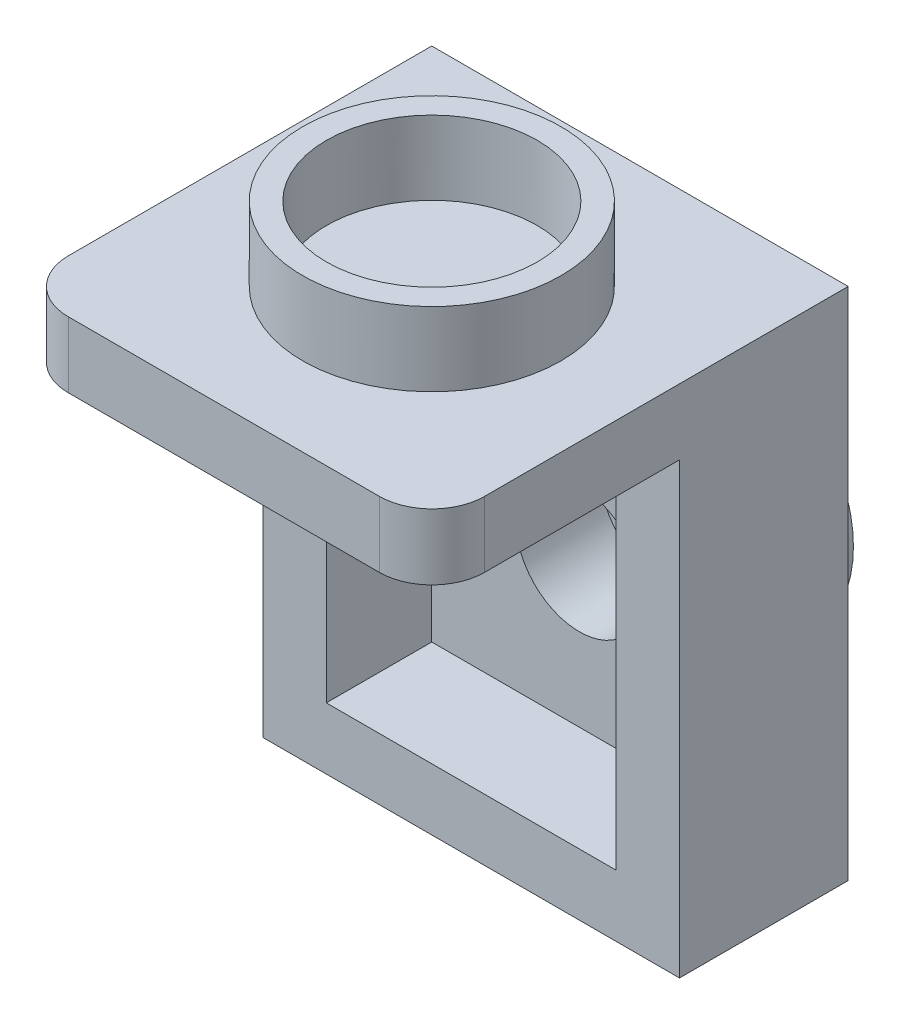
ISO-10303-21;
HEADER;
FILE_DESCRIPTION(('STEP AP214'),'2;1');
FILE_NAME('part.step','',(''),(''),'','','');
FILE_SCHEMA(('AUTOMOTIVE_DESIGN { 1 0 10303 214 1 1 1 1 }'));
ENDSEC;
DATA;
#1=APPLICATION_CONTEXT('core data for automotive mechanical design processes');
#2=APPLICATION_PROTOCOL_DEFINITION('international standard','automotive_design',2000,#1);
#3=PRODUCT_CONTEXT('',#1,'mechanical');
#4=PRODUCT('Part','Part','',(#3));
#5=PRODUCT_RELATED_PRODUCT_CATEGORY('part','',(#4));
#6=PRODUCT_DEFINITION_FORMATION('','',#4);
#7=PRODUCT_DEFINITION_CONTEXT('part definition',#1,'design');
#8=PRODUCT_DEFINITION('design','',#6,#7);
#9=PRODUCT_DEFINITION_SHAPE('','',#8);
#10=(LENGTH_UNIT() NAMED_UNIT(*) SI_UNIT(.MILLI.,.METRE.));
#11=(NAMED_UNIT(*) PLANE_ANGLE_UNIT() SI_UNIT($,.RADIAN.));
#12=(NAMED_UNIT(*) SI_UNIT($,.STERADIAN.) SOLID_ANGLE_UNIT());
#13=UNCERTAINTY_MEASURE_WITH_UNIT(LENGTH_MEASURE(1.E-05),#10,'distance_accuracy_value','');
#14=(GEOMETRIC_REPRESENTATION_CONTEXT(3) GLOBAL_UNCERTAINTY_ASSIGNED_CONTEXT((#13)) GLOBAL_UNIT_ASSIGNED_CONTEXT((#10,
#11,#12)) REPRESENTATION_CONTEXT('',''));
#15=CARTESIAN_POINT('',(0.,0.,0.));
#16=DIRECTION('',(0.,0.,1.));
#17=DIRECTION('',(1.,0.,0.));
#18=AXIS2_PLACEMENT_3D('',#15,#16,#17);
#19=CARTESIAN_POINT('',(0.68196721311474,7.9,-0.383745827528923));
#20=DIRECTION('',(0.,0.,-1.));
#21=DIRECTION('',(0.,1.,0.));
#22=AXIS2_PLACEMENT_3D('',#19,#20,#21);
#23=PLANE('',#22);
#24=CARTESIAN_POINT('',(4.68196721311474,-2.62398721030988,-0.383745827528924));
#25=DIRECTION('',(0.,0.,-1.));
#26=DIRECTION('',(0.,1.,0.));
#27=AXIS2_PLACEMENT_3D('',#24,#25,#26);
#28=CIRCLE('',#27,1.2);
#29=CARTESIAN_POINT('',(4.68196721311474,-1.42398721030988,-0.383745827528924));
#30=VERTEX_POINT('',#29);
#31=EDGE_CURVE('E222',#30,#30,#28,.T.);
#32=ORIENTED_EDGE('',*,*,#31,.T.);
#33=EDGE_LOOP('',(#32));
#34=FACE_BOUND('',#33,.T.);
#35=DIRECTION('',(-1.,0.,0.));
#36=VECTOR('',#35,1.);
#37=CARTESIAN_POINT('',(1.88196721311474,-5.39203477260854,-0.383745827528924));
#38=LINE('',#37,#36);
#39=CARTESIAN_POINT('',(7.38196721311474,-5.39203477260854,-0.383745827528924));
#40=VERTEX_POINT('',#39);
#41=CARTESIAN_POINT('',(1.88196721311474,-5.39203477260854,-0.383745827528926));
#42=VERTEX_POINT('',#41);
#43=EDGE_CURVE('E56',#40,#42,#38,.T.);
#44=ORIENTED_EDGE('',*,*,#43,.F.);
#45=DIRECTION('',(0.,-1.,0.));
#46=VECTOR('',#45,1.);
#47=CARTESIAN_POINT('',(7.38196721311474,0.,-0.383745827528924));
#48=LINE('',#47,#46);
#49=CARTESIAN_POINT('',(7.38196721311474,1.95059803250373,-0.383745827528924));
#50=VERTEX_POINT('',#49);
#51=EDGE_CURVE('E223',#50,#40,#48,.T.);
#52=ORIENTED_EDGE('',*,*,#51,.F.);
#53=DIRECTION('',(1.,0.,0.));
#54=VECTOR('',#53,1.);
#55=CARTESIAN_POINT('',(7.58196721311474,1.95059803250373,-0.383745827528924));
#56=LINE('',#55,#54);
#57=CARTESIAN_POINT('',(5.20864466505469,1.95059803250373,-0.383745827528924));
#58=VERTEX_POINT('',#57);
#59=EDGE_CURVE('E216',#58,#50,#56,.T.);
#60=ORIENTED_EDGE('',*,*,#59,.F.);
#61=DIRECTION('',(0.,1.,0.));
#62=VECTOR('',#61,1.);
#63=CARTESIAN_POINT('',(5.20864466505469,0.950598032503727,-0.383745827528924));
#64=LINE('',#63,#62);
#65=CARTESIAN_POINT('',(5.20864466505469,0.950598032503727,-0.383745827528924));
#66=VERTEX_POINT('',#65);
#67=EDGE_CURVE('E192',#66,#58,#64,.T.);
#68=ORIENTED_EDGE('',*,*,#67,.F.);
#69=DIRECTION('',(1.,0.,0.));
#70=VECTOR('',#69,1.);
#71=CARTESIAN_POINT('',(4.09676090832638,0.950598032503727,-0.383745827528924));
#72=LINE('',#71,#70);
#73=CARTESIAN_POINT('',(4.09676090832638,0.950598032503727,-0.383745827528924));
#74=VERTEX_POINT('',#73);
#75=EDGE_CURVE('E190',#74,#66,#72,.T.);
#76=ORIENTED_EDGE('',*,*,#75,.F.);
#77=DIRECTION('',(0.,-1.,0.));
#78=VECTOR('',#77,1.);
#79=CARTESIAN_POINT('',(4.09676090832638,1.95059803250373,-0.383745827528924));
#80=LINE('',#79,#78);
#81=CARTESIAN_POINT('',(4.09676090832638,1.95059803250373,-0.383745827528924));
#82=VERTEX_POINT('',#81);
#83=EDGE_CURVE('E188',#82,#74,#80,.T.);
#84=ORIENTED_EDGE('',*,*,#83,.F.);
#85=CARTESIAN_POINT('',(1.88196721311474,1.95059803250373,-0.383745827528924));
#86=VERTEX_POINT('',#85);
#87=EDGE_CURVE('E217',#86,#82,#56,.T.);
#88=ORIENTED_EDGE('',*,*,#87,.F.);
#89=DIRECTION('',(0.,1.,0.));
#90=VECTOR('',#89,1.);
#91=CARTESIAN_POINT('',(1.88196721311474,0.,-0.383745827528925));
#92=LINE('',#91,#90);
#93=EDGE_CURVE('E220',#42,#86,#92,.T.);
#94=ORIENTED_EDGE('',*,*,#93,.F.);
#95=EDGE_LOOP('',(#44,#52,#60,#68,#76,#84,#88,#94));
#96=FACE_BOUND('',#95,.T.);
#97=ADVANCED_FACE('F41',(#34,#96),#23,.F.);
#98=CARTESIAN_POINT('',(7.38196721311474,0.,0.));
#99=DIRECTION('',(-1.,0.,0.));
#100=DIRECTION('',(0.,0.,1.));
#101=AXIS2_PLACEMENT_3D('',#98,#99,#100);
#102=PLANE('',#101);
#103=ORIENTED_EDGE('',*,*,#51,.T.);
#104=DIRECTION('',(0.,0.,1.));
#105=VECTOR('',#104,1.);
#106=CARTESIAN_POINT('',(7.38196721311474,-5.39203477260854,-0.383745827528924));
#107=LINE('',#106,#105);
#108=CARTESIAN_POINT('',(7.38196721311474,-5.39203477260854,1.61625417247108));
#109=VERTEX_POINT('',#108);
#110=EDGE_CURVE('E172',#40,#109,#107,.T.);
#111=ORIENTED_EDGE('',*,*,#110,.T.);
#112=DIRECTION('',(0.,1.,0.));
#113=VECTOR('',#112,1.);
#114=CARTESIAN_POINT('',(7.38196721311474,0.,1.61625417247108));
#115=LINE('',#114,#113);
#116=CARTESIAN_POINT('',(7.38196721311474,1.95059803250373,1.61625417247108));
#117=VERTEX_POINT('',#116);
#118=EDGE_CURVE('E162',#109,#117,#115,.T.);
#119=ORIENTED_EDGE('',*,*,#118,.T.);
#120=DIRECTION('',(0.,0.,-1.));
#121=VECTOR('',#120,1.);
#122=CARTESIAN_POINT('',(7.38196721311474,1.95059803250373,0.));
#123=LINE('',#122,#121);
#124=EDGE_CURVE('E11',#117,#50,#123,.T.);
#125=ORIENTED_EDGE('',*,*,#124,.T.);
#126=EDGE_LOOP('',(#103,#111,#119,#125));
#127=FACE_BOUND('',#126,.T.);
#128=ADVANCED_FACE('F338',(#127),#102,.T.);
#129=CARTESIAN_POINT('',(8.58196721311474,-7.92398721030988,1.61625417247108));
#130=DIRECTION('',(0.,0.,1.));
#131=DIRECTION('',(1.,0.,0.));
#132=AXIS2_PLACEMENT_3D('',#129,#130,#131);
#133=PLANE('',#132);
#134=DIRECTION('',(0.,1.,0.));
#135=VECTOR('',#134,1.);
#136=CARTESIAN_POINT('',(0.681967213114738,-7.92398721030988,1.61625417247108));
#137=LINE('',#136,#135);
#138=CARTESIAN_POINT('',(0.68196721311474,-6.56232723805551,1.61625417247108));
#139=VERTEX_POINT('',#138);
#140=CARTESIAN_POINT('',(0.681967213114738,1.95059803250373,1.61625417247108));
#141=VERTEX_POINT('',#140);
#142=EDGE_CURVE('E232',#139,#141,#137,.T.);
#143=ORIENTED_EDGE('',*,*,#142,.F.);
#144=DIRECTION('',(-1.,0.,0.));
#145=VECTOR('',#144,1.);
#146=CARTESIAN_POINT('',(8.58196721311474,-6.56232723805551,1.61625417247108));
#147=LINE('',#146,#145);
#148=CARTESIAN_POINT('',(8.58196721311474,-6.56232723805551,1.61625417247108));
#149=VERTEX_POINT('',#148);
#150=EDGE_CURVE('E185',#149,#139,#147,.T.);
#151=ORIENTED_EDGE('',*,*,#150,.F.);
#152=DIRECTION('',(0.,1.,0.));
#153=VECTOR('',#152,1.);
#154=CARTESIAN_POINT('',(8.58196721311474,-7.92398721030988,1.61625417247108));
#155=LINE('',#154,#153);
#156=CARTESIAN_POINT('',(8.58196721311474,1.95059803250373,1.61625417247108));
#157=VERTEX_POINT('',#156);
#158=EDGE_CURVE('E226',#149,#157,#155,.T.);
#159=ORIENTED_EDGE('',*,*,#158,.T.);
#160=DIRECTION('',(-1.,0.,0.));
#161=VECTOR('',#160,1.);
#162=CARTESIAN_POINT('',(8.58196721311474,1.95059803250373,1.61625417247108));
#163=LINE('',#162,#161);
#164=EDGE_CURVE('E235',#157,#117,#163,.T.);
#165=ORIENTED_EDGE('',*,*,#164,.T.);
#166=ORIENTED_EDGE('',*,*,#118,.F.);
#167=DIRECTION('',(-1.,0.,0.));
#168=VECTOR('',#167,1.);
#169=CARTESIAN_POINT('',(1.88196721311474,-5.39203477260854,1.61625417247108));
#170=LINE('',#169,#168);
#171=CARTESIAN_POINT('',(1.88196721311474,-5.39203477260854,1.61625417247108));
#172=VERTEX_POINT('',#171);
#173=EDGE_CURVE('E166',#109,#172,#170,.T.);
#174=ORIENTED_EDGE('',*,*,#173,.T.);
#175=DIRECTION('',(0.,1.,0.));
#176=VECTOR('',#175,1.);
#177=CARTESIAN_POINT('',(1.88196721311474,-7.92398721030988,1.61625417247108));
#178=LINE('',#177,#176);
#179=CARTESIAN_POINT('',(1.88196721311474,1.95059803250373,1.61625417247108));
#180=VERTEX_POINT('',#179);
#181=EDGE_CURVE('E153',#172,#180,#178,.T.);
#182=ORIENTED_EDGE('',*,*,#181,.T.);
#183=EDGE_CURVE('E234',#180,#141,#163,.T.);
#184=ORIENTED_EDGE('',*,*,#183,.T.);
#185=EDGE_LOOP('',(#143,#151,#159,#165,#166,#174,#182,#184));
#186=FACE_BOUND('',#185,.T.);
#187=ADVANCED_FACE('F168',(#186),#133,.T.);
#188=CARTESIAN_POINT('',(8.58196721311474,1.95059803250373,6.31199399921964));
#189=DIRECTION('',(0.,1.,0.));
#190=DIRECTION('',(0.,0.,1.));
#191=AXIS2_PLACEMENT_3D('',#188,#189,#190);
#192=PLANE('',#191);
#193=DIRECTION('',(-1.,0.,0.));
#194=VECTOR('',#193,1.);
#195=CARTESIAN_POINT('',(4.09676090832638,1.95059803250373,0.416254172471076));
#196=LINE('',#195,#194);
#197=CARTESIAN_POINT('',(5.20864466505468,1.95059803250373,0.416254172471075));
#198=VERTEX_POINT('',#197);
#199=CARTESIAN_POINT('',(4.09676090832638,1.95059803250373,0.416254172471076));
#200=VERTEX_POINT('',#199);
#201=EDGE_CURVE('E195',#198,#200,#196,.T.);
#202=ORIENTED_EDGE('',*,*,#201,.F.);
#203=DIRECTION('',(0.,0.,1.));
#204=VECTOR('',#203,1.);
#205=CARTESIAN_POINT('',(5.20864466505469,1.95059803250373,-3.18574582752892));
#206=LINE('',#205,#204);
#207=EDGE_CURVE('E206',#58,#198,#206,.T.);
#208=ORIENTED_EDGE('',*,*,#207,.F.);
#209=ORIENTED_EDGE('',*,*,#59,.T.);
#210=ORIENTED_EDGE('',*,*,#124,.F.);
#211=ORIENTED_EDGE('',*,*,#164,.F.);
#212=DIRECTION('',(0.,0.,-1.));
#213=VECTOR('',#212,1.);
#214=CARTESIAN_POINT('',(8.58196721311474,1.95059803250373,6.31199399921964));
#215=LINE('',#214,#213);
#216=CARTESIAN_POINT('',(8.58196721311474,1.95059803250373,5.31199399921964));
#217=VERTEX_POINT('',#216);
#218=EDGE_CURVE('E238',#217,#157,#215,.T.);
#219=ORIENTED_EDGE('',*,*,#218,.F.);
#220=CARTESIAN_POINT('',(7.58196721311474,1.95059803250373,5.31199399921964));
#221=DIRECTION('',(0.,1.,0.));
#222=DIRECTION('',(0.,0.,1.));
#223=AXIS2_PLACEMENT_3D('',#220,#221,#222);
#224=CIRCLE('',#223,1.);
#225=CARTESIAN_POINT('',(7.58196721311474,1.95059803250373,6.31199399921964));
#226=VERTEX_POINT('',#225);
#227=EDGE_CURVE('E285',#217,#226,#224,.F.);
#228=ORIENTED_EDGE('',*,*,#227,.T.);
#229=DIRECTION('',(-1.,0.,0.));
#230=VECTOR('',#229,1.);
#231=CARTESIAN_POINT('',(8.58196721311474,1.95059803250373,6.31199399921964));
#232=LINE('',#231,#230);
#233=CARTESIAN_POINT('',(1.68196721311474,1.95059803250373,6.31199399921964));
#234=VERTEX_POINT('',#233);
#235=EDGE_CURVE('E241',#226,#234,#232,.T.);
#236=ORIENTED_EDGE('',*,*,#235,.T.);
#237=CARTESIAN_POINT('',(1.68196721311474,1.95059803250373,5.31199399921964));
#238=DIRECTION('',(0.,1.,0.));
#239=DIRECTION('',(0.,0.,1.));
#240=AXIS2_PLACEMENT_3D('',#237,#238,#239);
#241=CIRCLE('',#240,1.);
#242=CARTESIAN_POINT('',(0.681967213114738,1.95059803250373,5.31199399921964));
#243=VERTEX_POINT('',#242);
#244=EDGE_CURVE('E283',#234,#243,#241,.F.);
#245=ORIENTED_EDGE('',*,*,#244,.T.);
#246=DIRECTION('',(0.,0.,-1.));
#247=VECTOR('',#246,1.);
#248=CARTESIAN_POINT('',(0.681967213114738,1.95059803250373,6.31199399921964));
#249=LINE('',#248,#247);
#250=EDGE_CURVE('E237',#243,#141,#249,.T.);
#251=ORIENTED_EDGE('',*,*,#250,.T.);
#252=ORIENTED_EDGE('',*,*,#183,.F.);
#253=DIRECTION('',(0.,0.,-1.));
#254=VECTOR('',#253,1.);
#255=CARTESIAN_POINT('',(1.88196721311474,1.95059803250373,1.61625417247108));
#256=LINE('',#255,#254);
#257=EDGE_CURVE('E157',#180,#86,#256,.T.);
#258=ORIENTED_EDGE('',*,*,#257,.T.);
#259=ORIENTED_EDGE('',*,*,#87,.T.);
#260=DIRECTION('',(0.,0.,1.));
#261=VECTOR('',#260,1.);
#262=CARTESIAN_POINT('',(4.09676090832638,1.95059803250373,-3.18574582752892));
#263=LINE('',#262,#261);
#264=EDGE_CURVE('E194',#82,#200,#263,.T.);
#265=ORIENTED_EDGE('',*,*,#264,.T.);
#266=EDGE_LOOP('',(#202,#208,#209,#210,#211,#219,#228,#236,#245,#251,#252,#258,#259,#265));
#267=FACE_BOUND('',#266,.T.);
#268=ADVANCED_FACE('F323',(#267),#192,.F.);
#269=CARTESIAN_POINT('',(0.681967213114738,3.2,7.9));
#270=DIRECTION('',(0.,-1.,0.));
#271=DIRECTION('',(1.,0.,0.));
#272=AXIS2_PLACEMENT_3D('',#269,#270,#271);
#273=PLANE('',#272);
#274=CARTESIAN_POINT('',(4.63196721311474,3.2,2.36412408584536));
#275=DIRECTION('',(0.,-1.,0.));
#276=DIRECTION('',(1.,0.,0.));
#277=AXIS2_PLACEMENT_3D('',#274,#275,#276);
#278=CIRCLE('',#277,2.45);
#279=CARTESIAN_POINT('',(7.08196721311474,3.2,2.36412408584536));
#280=VERTEX_POINT('',#279);
#281=EDGE_CURVE('E263',#280,#280,#278,.F.);
#282=ORIENTED_EDGE('',*,*,#281,.F.);
#283=EDGE_LOOP('',(#282));
#284=FACE_BOUND('',#283,.T.);
#285=DIRECTION('',(-1.,0.,0.));
#286=VECTOR('',#285,1.);
#287=CARTESIAN_POINT('',(8.58196721311474,3.2,6.31199399921964));
#288=LINE('',#287,#286);
#289=CARTESIAN_POINT('',(7.58196721311474,3.2,6.31199399921964));
#290=VERTEX_POINT('',#289);
#291=CARTESIAN_POINT('',(1.68196721311474,3.2,6.31199399921964));
#292=VERTEX_POINT('',#291);
#293=EDGE_CURVE('E253',#290,#292,#288,.T.);
#294=ORIENTED_EDGE('',*,*,#293,.F.);
#295=CARTESIAN_POINT('',(7.58196721311474,3.2,5.31199399921964));
#296=DIRECTION('',(0.,-1.,0.));
#297=DIRECTION('',(1.,0.,0.));
#298=AXIS2_PLACEMENT_3D('',#295,#296,#297);
#299=CIRCLE('',#298,1.);
#300=CARTESIAN_POINT('',(8.58196721311474,3.2,5.31199399921964));
#301=VERTEX_POINT('',#300);
#302=EDGE_CURVE('E293',#290,#301,#299,.F.);
#303=ORIENTED_EDGE('',*,*,#302,.T.);
#304=DIRECTION('',(0.,0.,-1.));
#305=VECTOR('',#304,1.);
#306=CARTESIAN_POINT('',(8.58196721311474,3.2,6.4));
#307=LINE('',#306,#305);
#308=CARTESIAN_POINT('',(8.58196721311474,3.2,-1.58374582752892));
#309=VERTEX_POINT('',#308);
#310=EDGE_CURVE('E267',#301,#309,#307,.T.);
#311=ORIENTED_EDGE('',*,*,#310,.T.);
#312=DIRECTION('',(-1.,0.,0.));
#313=VECTOR('',#312,1.);
#314=CARTESIAN_POINT('',(8.58196721311474,3.2,-1.58374582752892));
#315=LINE('',#314,#313);
#316=CARTESIAN_POINT('',(0.681967213114738,3.2,-1.58374582752892));
#317=VERTEX_POINT('',#316);
#318=EDGE_CURVE('E259',#309,#317,#315,.T.);
#319=ORIENTED_EDGE('',*,*,#318,.T.);
#320=DIRECTION('',(0.,0.,-1.));
#321=VECTOR('',#320,1.);
#322=CARTESIAN_POINT('',(0.681967213114738,3.2,7.9));
#323=LINE('',#322,#321);
#324=CARTESIAN_POINT('',(0.681967213114738,3.2,5.31199399921964));
#325=VERTEX_POINT('',#324);
#326=EDGE_CURVE('E264',#325,#317,#323,.T.);
#327=ORIENTED_EDGE('',*,*,#326,.F.);
#328=CARTESIAN_POINT('',(1.68196721311474,3.2,5.31199399921964));
#329=DIRECTION('',(0.,-1.,0.));
#330=DIRECTION('',(1.,0.,0.));
#331=AXIS2_PLACEMENT_3D('',#328,#329,#330);
#332=CIRCLE('',#331,1.);
#333=EDGE_CURVE('E291',#325,#292,#332,.F.);
#334=ORIENTED_EDGE('',*,*,#333,.T.);
#335=EDGE_LOOP('',(#294,#303,#311,#319,#327,#334));
#336=FACE_BOUND('',#335,.T.);
#337=ADVANCED_FACE('F305',(#284,#336),#273,.F.);
#338=CARTESIAN_POINT('',(0.681967213114738,0.,7.9));
#339=DIRECTION('',(1.,0.,0.));
#340=DIRECTION('',(0.,0.,-1.));
#341=AXIS2_PLACEMENT_3D('',#338,#339,#340);
#342=PLANE('',#341);
#343=DIRECTION('',(0.,1.,0.));
#344=VECTOR('',#343,1.);
#345=CARTESIAN_POINT('',(0.68196721311474,7.9,-1.58374582752892));
#346=LINE('',#345,#344);
#347=CARTESIAN_POINT('',(0.68196721311474,-6.56232723805551,-1.58374582752892));
#348=VERTEX_POINT('',#347);
#349=EDGE_CURVE('E272',#348,#317,#346,.T.);
#350=ORIENTED_EDGE('',*,*,#349,.F.);
#351=DIRECTION('',(0.,0.,-1.));
#352=VECTOR('',#351,1.);
#353=CARTESIAN_POINT('',(0.68196721311474,-6.56232723805552,6.31199399921964));
#354=LINE('',#353,#352);
#355=EDGE_CURVE('E177',#139,#348,#354,.T.);
#356=ORIENTED_EDGE('',*,*,#355,.F.);
#357=ORIENTED_EDGE('',*,*,#142,.T.);
#358=ORIENTED_EDGE('',*,*,#250,.F.);
#359=DIRECTION('',(0.,1.,0.));
#360=VECTOR('',#359,1.);
#361=CARTESIAN_POINT('',(0.681967213114738,0.,5.31199399921964));
#362=LINE('',#361,#360);
#363=EDGE_CURVE('E49',#243,#325,#362,.T.);
#364=ORIENTED_EDGE('',*,*,#363,.T.);
#365=ORIENTED_EDGE('',*,*,#326,.T.);
#366=EDGE_LOOP('',(#350,#356,#357,#358,#364,#365));
#367=FACE_BOUND('',#366,.T.);
#368=ADVANCED_FACE('F300',(#367),#342,.F.);
#369=CARTESIAN_POINT('',(0.68196721311474,7.9,-1.58374582752892));
#370=DIRECTION('',(0.,0.,-1.));
#371=DIRECTION('',(0.,1.,0.));
#372=AXIS2_PLACEMENT_3D('',#369,#370,#371);
#373=PLANE('',#372);
#374=DIRECTION('',(1.,0.,0.));
#375=VECTOR('',#374,1.);
#376=CARTESIAN_POINT('',(0.68196721311474,-6.56232723805551,-1.58374582752892));
#377=LINE('',#376,#375);
#378=CARTESIAN_POINT('',(8.58196721311474,-6.56232723805551,-1.58374582752892));
#379=VERTEX_POINT('',#378);
#380=EDGE_CURVE('E175',#348,#379,#377,.T.);
#381=ORIENTED_EDGE('',*,*,#380,.F.);
#382=ORIENTED_EDGE('',*,*,#349,.T.);
#383=ORIENTED_EDGE('',*,*,#318,.F.);
#384=DIRECTION('',(0.,-1.,0.));
#385=VECTOR('',#384,1.);
#386=CARTESIAN_POINT('',(8.58196721311474,6.4,-1.58374582752892));
#387=LINE('',#386,#385);
#388=EDGE_CURVE('E269',#309,#379,#387,.T.);
#389=ORIENTED_EDGE('',*,*,#388,.T.);
#390=EDGE_LOOP('',(#381,#382,#383,#389));
#391=FACE_BOUND('',#390,.T.);
#392=CARTESIAN_POINT('',(4.68196721311474,-2.62398721030988,-1.58374582752892));
#393=DIRECTION('',(0.,0.,-1.));
#394=DIRECTION('',(0.,1.,0.));
#395=AXIS2_PLACEMENT_3D('',#392,#393,#394);
#396=CIRCLE('',#395,2.4);
#397=CARTESIAN_POINT('',(4.68196721311474,-0.223987210309879,-1.58374582752892));
#398=VERTEX_POINT('',#397);
#399=EDGE_CURVE('E260',#398,#398,#396,.T.);
#400=ORIENTED_EDGE('',*,*,#399,.F.);
#401=EDGE_LOOP('',(#400));
#402=FACE_BOUND('',#401,.T.);
#403=ADVANCED_FACE('F311',(#391,#402),#373,.T.);
#404=CARTESIAN_POINT('',(8.58196721311474,0.,0.));
#405=DIRECTION('',(-1.,0.,0.));
#406=DIRECTION('',(0.,0.,1.));
#407=AXIS2_PLACEMENT_3D('',#404,#405,#406);
#408=PLANE('',#407);
#409=ORIENTED_EDGE('',*,*,#158,.F.);
#410=DIRECTION('',(0.,0.,-1.));
#411=VECTOR('',#410,1.);
#412=CARTESIAN_POINT('',(8.58196721311474,-6.56232723805552,6.31199399921964));
#413=LINE('',#412,#411);
#414=EDGE_CURVE('E182',#149,#379,#413,.T.);
#415=ORIENTED_EDGE('',*,*,#414,.T.);
#416=ORIENTED_EDGE('',*,*,#388,.F.);
#417=ORIENTED_EDGE('',*,*,#310,.F.);
#418=DIRECTION('',(0.,-1.,0.));
#419=VECTOR('',#418,1.);
#420=CARTESIAN_POINT('',(8.58196721311474,0.,5.31199399921964));
#421=LINE('',#420,#419);
#422=EDGE_CURVE('E280',#301,#217,#421,.T.);
#423=ORIENTED_EDGE('',*,*,#422,.T.);
#424=ORIENTED_EDGE('',*,*,#218,.T.);
#425=EDGE_LOOP('',(#409,#415,#416,#417,#423,#424));
#426=FACE_BOUND('',#425,.T.);
#427=ADVANCED_FACE('F315',(#426),#408,.F.);
#428=CARTESIAN_POINT('',(4.68196721311474,-2.62398721030988,-3.18374582752892));
#429=DIRECTION('',(0.,0.,1.));
#430=DIRECTION('',(0.,-1.,0.));
#431=AXIS2_PLACEMENT_3D('',#428,#429,#430);
#432=CYLINDRICAL_SURFACE('',#431,2.4);
#433=CARTESIAN_POINT('',(4.68196721311474,-2.62398721030988,-3.18374582752892));
#434=DIRECTION('',(0.,0.,-1.));
#435=DIRECTION('',(0.,1.,0.));
#436=AXIS2_PLACEMENT_3D('',#433,#434,#435);
#437=CIRCLE('',#436,2.4);
#438=CARTESIAN_POINT('',(4.68196721311474,-0.223987210309879,-3.18374582752892));
#439=VERTEX_POINT('',#438);
#440=EDGE_CURVE('E256',#439,#439,#437,.T.);
#441=ORIENTED_EDGE('',*,*,#440,.F.);
#442=EDGE_LOOP('',(#441));
#443=FACE_BOUND('',#442,.T.);
#444=ORIENTED_EDGE('',*,*,#399,.T.);
#445=EDGE_LOOP('',(#444));
#446=FACE_BOUND('',#445,.T.);
#447=ADVANCED_FACE('F404',(#443,#446),#432,.T.);
#448=CARTESIAN_POINT('',(4.68196721311474,-2.62398721030988,-3.18374582752892));
#449=DIRECTION('',(0.,0.,-1.));
#450=DIRECTION('',(0.,1.,0.));
#451=AXIS2_PLACEMENT_3D('',#448,#449,#450);
#452=PLANE('',#451);
#453=ORIENTED_EDGE('',*,*,#440,.T.);
#454=EDGE_LOOP('',(#453));
#455=FACE_BOUND('',#454,.T.);
#456=ADVANCED_FACE('F401',(#455),#452,.T.);
#457=CARTESIAN_POINT('',(8.58196721311474,-7.92398721030988,6.31199399921964));
#458=DIRECTION('',(0.,0.,-1.));
#459=DIRECTION('',(-1.,0.,0.));
#460=AXIS2_PLACEMENT_3D('',#457,#458,#459);
#461=PLANE('',#460);
#462=ORIENTED_EDGE('',*,*,#235,.F.);
#463=DIRECTION('',(0.,-1.,0.));
#464=VECTOR('',#463,1.);
#465=CARTESIAN_POINT('',(7.58196721311474,-7.92398721030988,6.31199399921964));
#466=LINE('',#465,#464);
#467=EDGE_CURVE('E289',#226,#290,#466,.F.);
#468=ORIENTED_EDGE('',*,*,#467,.T.);
#469=ORIENTED_EDGE('',*,*,#293,.T.);
#470=DIRECTION('',(0.,1.,0.));
#471=VECTOR('',#470,1.);
#472=CARTESIAN_POINT('',(1.68196721311474,-7.92398721030988,6.31199399921964));
#473=LINE('',#472,#471);
#474=EDGE_CURVE('E287',#292,#234,#473,.F.);
#475=ORIENTED_EDGE('',*,*,#474,.T.);
#476=EDGE_LOOP('',(#462,#468,#469,#475));
#477=FACE_BOUND('',#476,.T.);
#478=ADVANCED_FACE('F327',(#477),#461,.F.);
#479=CARTESIAN_POINT('',(4.63196721311474,4.6,2.36412408584536));
#480=DIRECTION('',(0.,-1.,0.));
#481=DIRECTION('',(1.,0.,0.));
#482=AXIS2_PLACEMENT_3D('',#479,#480,#481);
#483=CYLINDRICAL_SURFACE('',#482,2.45);
#484=CARTESIAN_POINT('',(4.63196721311474,4.6,2.36412408584536));
#485=DIRECTION('',(0.,1.,0.));
#486=DIRECTION('',(-1.,0.,0.));
#487=AXIS2_PLACEMENT_3D('',#484,#485,#486);
#488=CIRCLE('',#487,2.45);
#489=CARTESIAN_POINT('',(2.18196721311474,4.6,2.36412408584536));
#490=VERTEX_POINT('',#489);
#491=EDGE_CURVE('E249',#490,#490,#488,.T.);
#492=ORIENTED_EDGE('',*,*,#491,.F.);
#493=EDGE_LOOP('',(#492));
#494=FACE_BOUND('',#493,.T.);
#495=ORIENTED_EDGE('',*,*,#281,.T.);
#496=EDGE_LOOP('',(#495));
#497=FACE_BOUND('',#496,.T.);
#498=ADVANCED_FACE('F390',(#494,#497),#483,.T.);
#499=CARTESIAN_POINT('',(4.63196721311474,4.6,2.36412408584536));
#500=DIRECTION('',(0.,-1.,0.));
#501=DIRECTION('',(1.,0.,0.));
#502=AXIS2_PLACEMENT_3D('',#499,#500,#501);
#503=CYLINDRICAL_SURFACE('',#502,2.);
#504=CARTESIAN_POINT('',(4.63196721311474,4.6,2.36412408584536));
#505=DIRECTION('',(0.,1.,0.));
#506=DIRECTION('',(-1.,0.,0.));
#507=AXIS2_PLACEMENT_3D('',#504,#505,#506);
#508=CIRCLE('',#507,2.);
#509=CARTESIAN_POINT('',(2.63196721311474,4.6,2.36412408584536));
#510=VERTEX_POINT('',#509);
#511=EDGE_CURVE('E246',#510,#510,#508,.T.);
#512=ORIENTED_EDGE('',*,*,#511,.T.);
#513=EDGE_LOOP('',(#512));
#514=FACE_BOUND('',#513,.T.);
#515=CARTESIAN_POINT('',(4.63196721311474,3.2,2.36412408584536));
#516=DIRECTION('',(0.,-1.,0.));
#517=DIRECTION('',(1.,0.,0.));
#518=AXIS2_PLACEMENT_3D('',#515,#516,#517);
#519=CIRCLE('',#518,2.);
#520=CARTESIAN_POINT('',(6.63196721311474,3.2,2.36412408584536));
#521=VERTEX_POINT('',#520);
#522=EDGE_CURVE('E252',#521,#521,#519,.F.);
#523=ORIENTED_EDGE('',*,*,#522,.F.);
#524=EDGE_LOOP('',(#523));
#525=FACE_BOUND('',#524,.T.);
#526=ADVANCED_FACE('F386',(#514,#525),#503,.F.);
#527=CARTESIAN_POINT('',(4.63196721311474,4.6,2.36412408584536));
#528=DIRECTION('',(0.,1.,0.));
#529=DIRECTION('',(-1.,0.,0.));
#530=AXIS2_PLACEMENT_3D('',#527,#528,#529);
#531=PLANE('',#530);
#532=ORIENTED_EDGE('',*,*,#491,.T.);
#533=EDGE_LOOP('',(#532));
#534=FACE_BOUND('',#533,.T.);
#535=ORIENTED_EDGE('',*,*,#511,.F.);
#536=EDGE_LOOP('',(#535));
#537=FACE_BOUND('',#536,.T.);
#538=ADVANCED_FACE('F389',(#534,#537),#531,.T.);
#539=ORIENTED_EDGE('',*,*,#522,.T.);
#540=EDGE_LOOP('',(#539));
#541=FACE_BOUND('',#540,.T.);
#542=ADVANCED_FACE('F394',(#541),#273,.F.);
#543=CARTESIAN_POINT('',(7.58196721311474,0.,5.31199399921964));
#544=DIRECTION('',(0.,-1.,0.));
#545=DIRECTION('',(0.,0.,-1.));
#546=AXIS2_PLACEMENT_3D('',#543,#544,#545);
#547=CYLINDRICAL_SURFACE('',#546,1.);
#548=ORIENTED_EDGE('',*,*,#302,.F.);
#549=ORIENTED_EDGE('',*,*,#467,.F.);
#550=ORIENTED_EDGE('',*,*,#227,.F.);
#551=ORIENTED_EDGE('',*,*,#422,.F.);
#552=EDGE_LOOP('',(#548,#549,#550,#551));
#553=FACE_BOUND('',#552,.T.);
#554=ADVANCED_FACE('F331',(#553),#547,.T.);
#555=CARTESIAN_POINT('',(1.68196721311474,0.,5.31199399921964));
#556=DIRECTION('',(0.,1.,0.));
#557=DIRECTION('',(0.,0.,1.));
#558=AXIS2_PLACEMENT_3D('',#555,#556,#557);
#559=CYLINDRICAL_SURFACE('',#558,1.);
#560=ORIENTED_EDGE('',*,*,#244,.F.);
#561=ORIENTED_EDGE('',*,*,#474,.F.);
#562=ORIENTED_EDGE('',*,*,#333,.F.);
#563=ORIENTED_EDGE('',*,*,#363,.F.);
#564=EDGE_LOOP('',(#560,#561,#562,#563));
#565=FACE_BOUND('',#564,.T.);
#566=ADVANCED_FACE('F43',(#565),#559,.T.);
#567=CARTESIAN_POINT('',(1.88196721311474,0.,7.9));
#568=DIRECTION('',(1.,0.,0.));
#569=DIRECTION('',(0.,0.,-1.));
#570=AXIS2_PLACEMENT_3D('',#567,#568,#569);
#571=PLANE('',#570);
#572=DIRECTION('',(0.,0.,1.));
#573=VECTOR('',#572,1.);
#574=CARTESIAN_POINT('',(1.88196721311474,-5.39203477260854,-0.383745827528924));
#575=LINE('',#574,#573);
#576=EDGE_CURVE('E64',#42,#172,#575,.T.);
#577=ORIENTED_EDGE('',*,*,#576,.F.);
#578=ORIENTED_EDGE('',*,*,#93,.T.);
#579=ORIENTED_EDGE('',*,*,#257,.F.);
#580=ORIENTED_EDGE('',*,*,#181,.F.);
#581=EDGE_LOOP('',(#577,#578,#579,#580));
#582=FACE_BOUND('',#581,.T.);
#583=ADVANCED_FACE('F155',(#582),#571,.T.);
#584=CARTESIAN_POINT('',(4.68196721311474,-2.62398721030988,-3.18374582752892));
#585=DIRECTION('',(0.,0.,1.));
#586=DIRECTION('',(0.,-1.,0.));
#587=AXIS2_PLACEMENT_3D('',#584,#585,#586);
#588=CYLINDRICAL_SURFACE('',#587,1.2);
#589=CARTESIAN_POINT('',(4.68196721311474,-2.62398721030988,-1.98374582752892));
#590=DIRECTION('',(0.,0.,-1.));
#591=DIRECTION('',(0.,1.,0.));
#592=AXIS2_PLACEMENT_3D('',#589,#590,#591);
#593=CIRCLE('',#592,1.2);
#594=CARTESIAN_POINT('',(4.68196721311474,-1.42398721030988,-1.98374582752892));
#595=VERTEX_POINT('',#594);
#596=EDGE_CURVE('E161',#595,#595,#593,.T.);
#597=ORIENTED_EDGE('',*,*,#596,.T.);
#598=EDGE_LOOP('',(#597));
#599=FACE_BOUND('',#598,.T.);
#600=ORIENTED_EDGE('',*,*,#31,.F.);
#601=EDGE_LOOP('',(#600));
#602=FACE_BOUND('',#601,.T.);
#603=ADVANCED_FACE('F375',(#599,#602),#588,.F.);
#604=CARTESIAN_POINT('',(4.68196721311474,-2.62398721030988,-1.98374582752892));
#605=DIRECTION('',(0.,0.,-1.));
#606=DIRECTION('',(0.,1.,0.));
#607=AXIS2_PLACEMENT_3D('',#604,#605,#606);
#608=PLANE('',#607);
#609=ORIENTED_EDGE('',*,*,#596,.F.);
#610=EDGE_LOOP('',(#609));
#611=FACE_BOUND('',#610,.T.);
#612=ADVANCED_FACE('F362',(#611),#608,.F.);
#613=CARTESIAN_POINT('',(5.20864466505469,0.950598032503727,-3.18574582752892));
#614=DIRECTION('',(1.,0.,0.));
#615=DIRECTION('',(0.,0.,-1.));
#616=AXIS2_PLACEMENT_3D('',#613,#614,#615);
#617=PLANE('',#616);
#618=DIRECTION('',(0.,0.,1.));
#619=VECTOR('',#618,1.);
#620=CARTESIAN_POINT('',(5.20864466505469,0.950598032503727,-3.18574582752892));
#621=LINE('',#620,#619);
#622=CARTESIAN_POINT('',(5.20864466505469,0.950598032503727,0.416254172471076));
#623=VERTEX_POINT('',#622);
#624=EDGE_CURVE('E211',#66,#623,#621,.T.);
#625=ORIENTED_EDGE('',*,*,#624,.F.);
#626=ORIENTED_EDGE('',*,*,#67,.T.);
#627=ORIENTED_EDGE('',*,*,#207,.T.);
#628=DIRECTION('',(0.,1.,0.));
#629=VECTOR('',#628,1.);
#630=CARTESIAN_POINT('',(5.20864466505469,0.950598032503727,0.416254172471076));
#631=LINE('',#630,#629);
#632=EDGE_CURVE('E198',#623,#198,#631,.T.);
#633=ORIENTED_EDGE('',*,*,#632,.F.);
#634=EDGE_LOOP('',(#625,#626,#627,#633));
#635=FACE_BOUND('',#634,.T.);
#636=ADVANCED_FACE('F344',(#635),#617,.T.);
#637=CARTESIAN_POINT('',(4.09676090832638,0.950598032503727,-3.18574582752892));
#638=DIRECTION('',(0.,-1.,0.));
#639=DIRECTION('',(0.,0.,-1.));
#640=AXIS2_PLACEMENT_3D('',#637,#638,#639);
#641=PLANE('',#640);
#642=DIRECTION('',(0.,0.,1.));
#643=VECTOR('',#642,1.);
#644=CARTESIAN_POINT('',(4.09676090832638,0.950598032503727,-3.18574582752892));
#645=LINE('',#644,#643);
#646=CARTESIAN_POINT('',(4.09676090832638,0.950598032503727,0.416254172471076));
#647=VERTEX_POINT('',#646);
#648=EDGE_CURVE('E209',#74,#647,#645,.T.);
#649=ORIENTED_EDGE('',*,*,#648,.F.);
#650=ORIENTED_EDGE('',*,*,#75,.T.);
#651=ORIENTED_EDGE('',*,*,#624,.T.);
#652=DIRECTION('',(1.,0.,0.));
#653=VECTOR('',#652,1.);
#654=CARTESIAN_POINT('',(4.09676090832638,0.950598032503727,0.416254172471076));
#655=LINE('',#654,#653);
#656=EDGE_CURVE('E200',#647,#623,#655,.T.);
#657=ORIENTED_EDGE('',*,*,#656,.F.);
#658=EDGE_LOOP('',(#649,#650,#651,#657));
#659=FACE_BOUND('',#658,.T.);
#660=ADVANCED_FACE('F351',(#659),#641,.T.);
#661=CARTESIAN_POINT('',(4.09676090832638,1.95059803250373,-3.18574582752892));
#662=DIRECTION('',(-1.,0.,0.));
#663=DIRECTION('',(0.,0.,1.));
#664=AXIS2_PLACEMENT_3D('',#661,#662,#663);
#665=PLANE('',#664);
#666=ORIENTED_EDGE('',*,*,#264,.F.);
#667=ORIENTED_EDGE('',*,*,#83,.T.);
#668=ORIENTED_EDGE('',*,*,#648,.T.);
#669=DIRECTION('',(0.,-1.,0.));
#670=VECTOR('',#669,1.);
#671=CARTESIAN_POINT('',(4.09676090832638,1.95059803250373,0.416254172471076));
#672=LINE('',#671,#670);
#673=EDGE_CURVE('E203',#200,#647,#672,.T.);
#674=ORIENTED_EDGE('',*,*,#673,.F.);
#675=EDGE_LOOP('',(#666,#667,#668,#674));
#676=FACE_BOUND('',#675,.T.);
#677=ADVANCED_FACE('F353',(#676),#665,.T.);
#678=CARTESIAN_POINT('',(0.,0.,0.416254172471076));
#679=DIRECTION('',(0.,0.,1.));
#680=DIRECTION('',(1.,0.,0.));
#681=AXIS2_PLACEMENT_3D('',#678,#679,#680);
#682=PLANE('',#681);
#683=ORIENTED_EDGE('',*,*,#201,.T.);
#684=ORIENTED_EDGE('',*,*,#673,.T.);
#685=ORIENTED_EDGE('',*,*,#656,.T.);
#686=ORIENTED_EDGE('',*,*,#632,.T.);
#687=EDGE_LOOP('',(#683,#684,#685,#686));
#688=FACE_BOUND('',#687,.T.);
#689=ADVANCED_FACE('F347',(#688),#682,.T.);
#690=CARTESIAN_POINT('',(0.68196721311474,-6.56232723805552,6.31199399921964));
#691=DIRECTION('',(0.,1.,0.));
#692=DIRECTION('',(0.,0.,1.));
#693=AXIS2_PLACEMENT_3D('',#690,#691,#692);
#694=PLANE('',#693);
#695=ORIENTED_EDGE('',*,*,#150,.T.);
#696=ORIENTED_EDGE('',*,*,#355,.T.);
#697=ORIENTED_EDGE('',*,*,#380,.T.);
#698=ORIENTED_EDGE('',*,*,#414,.F.);
#699=EDGE_LOOP('',(#695,#696,#697,#698));
#700=FACE_BOUND('',#699,.T.);
#701=ADVANCED_FACE('F319',(#700),#694,.F.);
#702=CARTESIAN_POINT('',(1.88196721311474,-5.39203477260854,-0.383745827528924));
#703=DIRECTION('',(0.,1.,0.));
#704=DIRECTION('',(0.,0.,1.));
#705=AXIS2_PLACEMENT_3D('',#702,#703,#704);
#706=PLANE('',#705);
#707=ORIENTED_EDGE('',*,*,#576,.T.);
#708=ORIENTED_EDGE('',*,*,#173,.F.);
#709=ORIENTED_EDGE('',*,*,#110,.F.);
#710=ORIENTED_EDGE('',*,*,#43,.T.);
#711=EDGE_LOOP('',(#707,#708,#709,#710));
#712=FACE_BOUND('',#711,.T.);
#713=ADVANCED_FACE('F174',(#712),#706,.T.);
#714=CLOSED_SHELL('',(#97,#128,#187,#268,#337,#368,#403,#427,#447,#456,#478,#498,#526,#538,#542,
#554,#566,#583,#603,#612,#636,#660,#677,#689,#701,#713));
#715=MANIFOLD_SOLID_BREP('B2',#714);
#716=ADVANCED_BREP_SHAPE_REPRESENTATION('',(#18,#715),#14);
#717=SHAPE_DEFINITION_REPRESENTATION(#9,#716);
ENDSEC;
END-ISO-10303-21;
